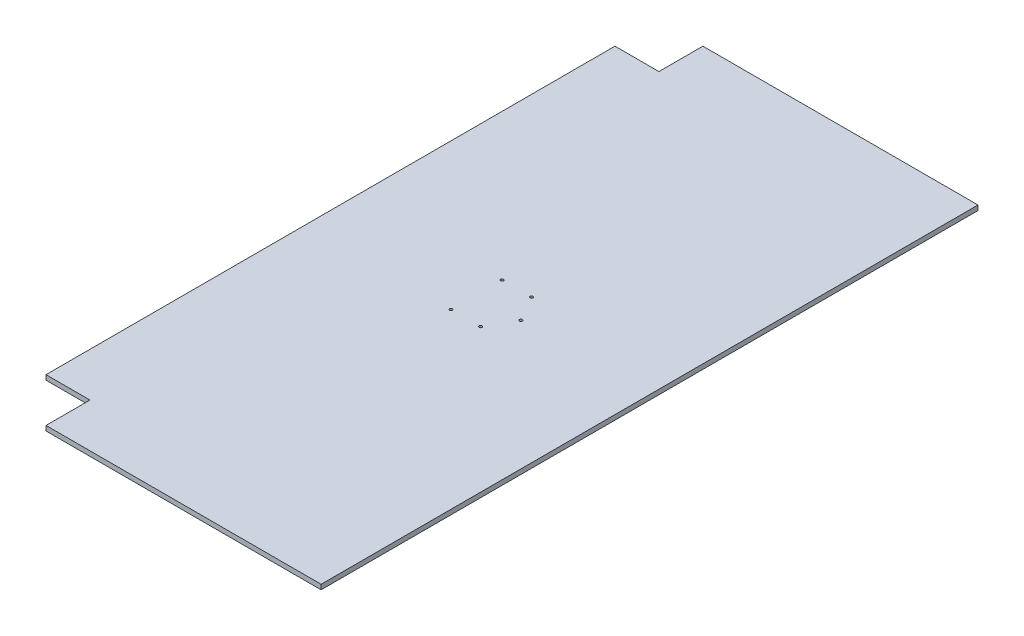
ISO-10303-21;
HEADER;
FILE_DESCRIPTION(('STEP AP214'),'2;1');
FILE_NAME('part.step','',(''),(''),'','','');
FILE_SCHEMA(('AUTOMOTIVE_DESIGN { 1 0 10303 214 1 1 1 1 }'));
ENDSEC;
DATA;
#1=APPLICATION_CONTEXT('core data for automotive mechanical design processes');
#2=APPLICATION_PROTOCOL_DEFINITION('international standard','automotive_design',2000,#1);
#3=PRODUCT_CONTEXT('',#1,'mechanical');
#4=PRODUCT('Part','Part','',(#3));
#5=PRODUCT_RELATED_PRODUCT_CATEGORY('part','',(#4));
#6=PRODUCT_DEFINITION_FORMATION('','',#4);
#7=PRODUCT_DEFINITION_CONTEXT('part definition',#1,'design');
#8=PRODUCT_DEFINITION('design','',#6,#7);
#9=PRODUCT_DEFINITION_SHAPE('','',#8);
#10=(LENGTH_UNIT() NAMED_UNIT(*) SI_UNIT(.MILLI.,.METRE.));
#11=(NAMED_UNIT(*) PLANE_ANGLE_UNIT() SI_UNIT($,.RADIAN.));
#12=(NAMED_UNIT(*) SI_UNIT($,.STERADIAN.) SOLID_ANGLE_UNIT());
#13=UNCERTAINTY_MEASURE_WITH_UNIT(LENGTH_MEASURE(1.E-05),#10,'distance_accuracy_value','');
#14=(GEOMETRIC_REPRESENTATION_CONTEXT(3) GLOBAL_UNCERTAINTY_ASSIGNED_CONTEXT((#13)) GLOBAL_UNIT_ASSIGNED_CONTEXT((#10,
#11,#12)) REPRESENTATION_CONTEXT('',''));
#15=CARTESIAN_POINT('',(0.,0.,0.));
#16=DIRECTION('',(0.,0.,1.));
#17=DIRECTION('',(1.,0.,0.));
#18=AXIS2_PLACEMENT_3D('',#15,#16,#17);
#19=CARTESIAN_POINT('',(0.,9.,612.5));
#20=DIRECTION('',(0.,0.,-1.));
#21=DIRECTION('',(-1.,0.,0.));
#22=AXIS2_PLACEMENT_3D('',#19,#20,#21);
#23=PLANE('',#22);
#24=DIRECTION('',(1.,0.,0.));
#25=VECTOR('',#24,1.);
#26=CARTESIAN_POINT('',(0.,9.,612.5));
#27=LINE('',#26,#25);
#28=CARTESIAN_POINT('',(-222.5,9.,612.5));
#29=VERTEX_POINT('',#28);
#30=CARTESIAN_POINT('',(290.5,9.,612.5));
#31=VERTEX_POINT('',#30);
#32=EDGE_CURVE('E119',#29,#31,#27,.T.);
#33=ORIENTED_EDGE('',*,*,#32,.F.);
#34=DIRECTION('',(0.,1.,0.));
#35=VECTOR('',#34,1.);
#36=CARTESIAN_POINT('',(-222.5,-1.,612.5));
#37=LINE('',#36,#35);
#38=CARTESIAN_POINT('',(-222.5,0.,612.5));
#39=VERTEX_POINT('',#38);
#40=EDGE_CURVE('E105',#39,#29,#37,.T.);
#41=ORIENTED_EDGE('',*,*,#40,.F.);
#42=DIRECTION('',(1.,0.,0.));
#43=VECTOR('',#42,1.);
#44=CARTESIAN_POINT('',(0.,0.,612.5));
#45=LINE('',#44,#43);
#46=CARTESIAN_POINT('',(290.5,0.,612.5));
#47=VERTEX_POINT('',#46);
#48=EDGE_CURVE('E142',#39,#47,#45,.T.);
#49=ORIENTED_EDGE('',*,*,#48,.T.);
#50=DIRECTION('',(0.,1.,0.));
#51=VECTOR('',#50,1.);
#52=CARTESIAN_POINT('',(290.5,-1.,612.5));
#53=LINE('',#52,#51);
#54=EDGE_CURVE('E126',#47,#31,#53,.T.);
#55=ORIENTED_EDGE('',*,*,#54,.T.);
#56=EDGE_LOOP('',(#33,#41,#49,#55));
#57=FACE_BOUND('',#56,.T.);
#58=ADVANCED_FACE('F41',(#57),#23,.F.);
#59=CARTESIAN_POINT('',(0.,9.,-612.5));
#60=DIRECTION('',(0.,0.,-1.));
#61=DIRECTION('',(-1.,0.,0.));
#62=AXIS2_PLACEMENT_3D('',#59,#60,#61);
#63=PLANE('',#62);
#64=DIRECTION('',(0.,1.,0.));
#65=VECTOR('',#64,1.);
#66=CARTESIAN_POINT('',(-222.5,-1.,-612.5));
#67=LINE('',#66,#65);
#68=CARTESIAN_POINT('',(-222.5,0.,-612.5));
#69=VERTEX_POINT('',#68);
#70=CARTESIAN_POINT('',(-222.5,9.,-612.5));
#71=VERTEX_POINT('',#70);
#72=EDGE_CURVE('E168',#69,#71,#67,.T.);
#73=ORIENTED_EDGE('',*,*,#72,.T.);
#74=DIRECTION('',(1.,0.,0.));
#75=VECTOR('',#74,1.);
#76=CARTESIAN_POINT('',(0.,9.,-612.5));
#77=LINE('',#76,#75);
#78=CARTESIAN_POINT('',(290.5,9.,-612.5));
#79=VERTEX_POINT('',#78);
#80=EDGE_CURVE('E127',#71,#79,#77,.T.);
#81=ORIENTED_EDGE('',*,*,#80,.T.);
#82=DIRECTION('',(0.,1.,0.));
#83=VECTOR('',#82,1.);
#84=CARTESIAN_POINT('',(290.5,-1.,-612.5));
#85=LINE('',#84,#83);
#86=CARTESIAN_POINT('',(290.5,0.,-612.5));
#87=VERTEX_POINT('',#86);
#88=EDGE_CURVE('E136',#87,#79,#85,.T.);
#89=ORIENTED_EDGE('',*,*,#88,.F.);
#90=DIRECTION('',(1.,0.,0.));
#91=VECTOR('',#90,1.);
#92=CARTESIAN_POINT('',(0.,0.,-612.5));
#93=LINE('',#92,#91);
#94=EDGE_CURVE('E133',#69,#87,#93,.T.);
#95=ORIENTED_EDGE('',*,*,#94,.F.);
#96=EDGE_LOOP('',(#73,#81,#89,#95));
#97=FACE_BOUND('',#96,.T.);
#98=ADVANCED_FACE('F192',(#97),#63,.T.);
#99=CARTESIAN_POINT('',(-304.5,9.,0.));
#100=DIRECTION('',(-1.,0.,0.));
#101=DIRECTION('',(0.,0.,1.));
#102=AXIS2_PLACEMENT_3D('',#99,#100,#101);
#103=PLANE('',#102);
#104=DIRECTION('',(0.,1.,0.));
#105=VECTOR('',#104,1.);
#106=CARTESIAN_POINT('',(-304.5,-1.,530.5));
#107=LINE('',#106,#105);
#108=CARTESIAN_POINT('',(-304.5,0.,530.5));
#109=VERTEX_POINT('',#108);
#110=CARTESIAN_POINT('',(-304.5,9.,530.5));
#111=VERTEX_POINT('',#110);
#112=EDGE_CURVE('E184',#109,#111,#107,.T.);
#113=ORIENTED_EDGE('',*,*,#112,.T.);
#114=DIRECTION('',(0.,0.,-1.));
#115=VECTOR('',#114,1.);
#116=CARTESIAN_POINT('',(-304.5,9.,0.));
#117=LINE('',#116,#115);
#118=CARTESIAN_POINT('',(-304.5,9.,-530.5));
#119=VERTEX_POINT('',#118);
#120=EDGE_CURVE('E130',#111,#119,#117,.T.);
#121=ORIENTED_EDGE('',*,*,#120,.T.);
#122=DIRECTION('',(0.,1.,0.));
#123=VECTOR('',#122,1.);
#124=CARTESIAN_POINT('',(-304.5,-1.,-530.5));
#125=LINE('',#124,#123);
#126=CARTESIAN_POINT('',(-304.5,0.,-530.5));
#127=VERTEX_POINT('',#126);
#128=EDGE_CURVE('E176',#127,#119,#125,.T.);
#129=ORIENTED_EDGE('',*,*,#128,.F.);
#130=DIRECTION('',(0.,0.,-1.));
#131=VECTOR('',#130,1.);
#132=CARTESIAN_POINT('',(-304.5,0.,0.));
#133=LINE('',#132,#131);
#134=EDGE_CURVE('E128',#109,#127,#133,.T.);
#135=ORIENTED_EDGE('',*,*,#134,.F.);
#136=EDGE_LOOP('',(#113,#121,#129,#135));
#137=FACE_BOUND('',#136,.T.);
#138=ADVANCED_FACE('F194',(#137),#103,.T.);
#139=CARTESIAN_POINT('',(0.,9.,0.));
#140=DIRECTION('',(0.,1.,0.));
#141=DIRECTION('',(0.,0.,1.));
#142=AXIS2_PLACEMENT_3D('',#139,#140,#141);
#143=PLANE('',#142);
#144=CARTESIAN_POINT('',(-32.000000000002,9.,-47.6313972081453));
#145=DIRECTION('',(0.,1.,0.));
#146=DIRECTION('',(0.,0.,1.));
#147=AXIS2_PLACEMENT_3D('',#144,#145,#146);
#148=CIRCLE('',#147,2.75000000000066);
#149=CARTESIAN_POINT('',(-32.000000000002,9.,-44.8813972081447));
#150=VERTEX_POINT('',#149);
#151=EDGE_CURVE('E262',#150,#150,#148,.T.);
#152=ORIENTED_EDGE('',*,*,#151,.F.);
#153=EDGE_LOOP('',(#152));
#154=FACE_BOUND('',#153,.T.);
#155=CARTESIAN_POINT('',(50.5,9.,-4.70023291936268E-12));
#156=DIRECTION('',(0.,1.,0.));
#157=DIRECTION('',(0.,0.,1.));
#158=AXIS2_PLACEMENT_3D('',#155,#156,#157);
#159=CIRCLE('',#158,2.75000000000483);
#160=CARTESIAN_POINT('',(50.5,9.,2.75000000000013));
#161=VERTEX_POINT('',#160);
#162=EDGE_CURVE('E265',#161,#161,#159,.T.);
#163=ORIENTED_EDGE('',*,*,#162,.F.);
#164=EDGE_LOOP('',(#163));
#165=FACE_BOUND('',#164,.T.);
#166=CARTESIAN_POINT('',(23.0000000000021,9.,47.6313972081406));
#167=DIRECTION('',(0.,1.,0.));
#168=DIRECTION('',(0.,0.,1.));
#169=AXIS2_PLACEMENT_3D('',#166,#167,#168);
#170=CIRCLE('',#169,2.75000000000444);
#171=CARTESIAN_POINT('',(23.0000000000021,9.,50.381397208145));
#172=VERTEX_POINT('',#171);
#173=EDGE_CURVE('E268',#172,#172,#170,.T.);
#174=ORIENTED_EDGE('',*,*,#173,.F.);
#175=EDGE_LOOP('',(#174));
#176=FACE_BOUND('',#175,.T.);
#177=CARTESIAN_POINT('',(-31.9999999999979,9.,47.6313972081429));
#178=DIRECTION('',(0.,1.,0.));
#179=DIRECTION('',(0.,0.,1.));
#180=AXIS2_PLACEMENT_3D('',#177,#178,#179);
#181=CIRCLE('',#180,2.75000000000237);
#182=CARTESIAN_POINT('',(-31.9999999999979,9.,50.3813972081453));
#183=VERTEX_POINT('',#182);
#184=EDGE_CURVE('E247',#183,#183,#181,.T.);
#185=ORIENTED_EDGE('',*,*,#184,.F.);
#186=EDGE_LOOP('',(#185));
#187=FACE_BOUND('',#186,.T.);
#188=CARTESIAN_POINT('',(22.999999999998,9.,-47.6313972081477));
#189=DIRECTION('',(0.,1.,0.));
#190=DIRECTION('',(0.,0.,1.));
#191=AXIS2_PLACEMENT_3D('',#188,#189,#190);
#192=CIRCLE('',#191,2.75000000000301);
#193=CARTESIAN_POINT('',(22.999999999998,9.,-44.8813972081446));
#194=VERTEX_POINT('',#193);
#195=EDGE_CURVE('E158',#194,#194,#192,.T.);
#196=ORIENTED_EDGE('',*,*,#195,.F.);
#197=EDGE_LOOP('',(#196));
#198=FACE_BOUND('',#197,.T.);
#199=DIRECTION('',(-1.,0.,0.));
#200=VECTOR('',#199,1.);
#201=CARTESIAN_POINT('',(-304.5,9.,530.5));
#202=LINE('',#201,#200);
#203=CARTESIAN_POINT('',(-222.5,9.,530.5));
#204=VERTEX_POINT('',#203);
#205=EDGE_CURVE('E114',#204,#111,#202,.T.);
#206=ORIENTED_EDGE('',*,*,#205,.F.);
#207=DIRECTION('',(0.,0.,-1.));
#208=VECTOR('',#207,1.);
#209=CARTESIAN_POINT('',(-222.5,9.,612.5));
#210=LINE('',#209,#208);
#211=EDGE_CURVE('E108',#29,#204,#210,.T.);
#212=ORIENTED_EDGE('',*,*,#211,.F.);
#213=ORIENTED_EDGE('',*,*,#32,.T.);
#214=DIRECTION('',(0.,0.,1.));
#215=VECTOR('',#214,1.);
#216=CARTESIAN_POINT('',(290.5,9.,0.));
#217=LINE('',#216,#215);
#218=EDGE_CURVE('E183',#79,#31,#217,.T.);
#219=ORIENTED_EDGE('',*,*,#218,.F.);
#220=ORIENTED_EDGE('',*,*,#80,.F.);
#221=DIRECTION('',(0.,0.,-1.));
#222=VECTOR('',#221,1.);
#223=CARTESIAN_POINT('',(-222.5,9.,-612.5));
#224=LINE('',#223,#222);
#225=CARTESIAN_POINT('',(-222.5,9.,-530.5));
#226=VERTEX_POINT('',#225);
#227=EDGE_CURVE('E180',#226,#71,#224,.T.);
#228=ORIENTED_EDGE('',*,*,#227,.F.);
#229=DIRECTION('',(1.,0.,0.));
#230=VECTOR('',#229,1.);
#231=CARTESIAN_POINT('',(-304.5,9.,-530.5));
#232=LINE('',#231,#230);
#233=EDGE_CURVE('E122',#119,#226,#232,.T.);
#234=ORIENTED_EDGE('',*,*,#233,.F.);
#235=ORIENTED_EDGE('',*,*,#120,.F.);
#236=EDGE_LOOP('',(#206,#212,#213,#219,#220,#228,#234,#235));
#237=FACE_BOUND('',#236,.T.);
#238=ADVANCED_FACE('F117',(#154,#165,#176,#187,#198,#237),#143,.T.);
#239=CARTESIAN_POINT('',(0.,0.,0.));
#240=DIRECTION('',(0.,1.,0.));
#241=DIRECTION('',(0.,0.,1.));
#242=AXIS2_PLACEMENT_3D('',#239,#240,#241);
#243=PLANE('',#242);
#244=CARTESIAN_POINT('',(-32.000000000002,0.,-47.6313972081453));
#245=DIRECTION('',(0.,1.,0.));
#246=DIRECTION('',(0.,0.,1.));
#247=AXIS2_PLACEMENT_3D('',#244,#245,#246);
#248=CIRCLE('',#247,2.75000000000066);
#249=CARTESIAN_POINT('',(-32.000000000002,0.,-44.8813972081447));
#250=VERTEX_POINT('',#249);
#251=EDGE_CURVE('E44',#250,#250,#248,.T.);
#252=ORIENTED_EDGE('',*,*,#251,.T.);
#253=EDGE_LOOP('',(#252));
#254=FACE_BOUND('',#253,.T.);
#255=CARTESIAN_POINT('',(50.5,0.,-4.70023291936268E-12));
#256=DIRECTION('',(0.,1.,0.));
#257=DIRECTION('',(0.,0.,1.));
#258=AXIS2_PLACEMENT_3D('',#255,#256,#257);
#259=CIRCLE('',#258,2.75000000000483);
#260=CARTESIAN_POINT('',(50.5,0.,2.75000000000013));
#261=VERTEX_POINT('',#260);
#262=EDGE_CURVE('E163',#261,#261,#259,.T.);
#263=ORIENTED_EDGE('',*,*,#262,.T.);
#264=EDGE_LOOP('',(#263));
#265=FACE_BOUND('',#264,.T.);
#266=CARTESIAN_POINT('',(23.0000000000021,0.,47.6313972081406));
#267=DIRECTION('',(0.,1.,0.));
#268=DIRECTION('',(0.,0.,1.));
#269=AXIS2_PLACEMENT_3D('',#266,#267,#268);
#270=CIRCLE('',#269,2.75000000000444);
#271=CARTESIAN_POINT('',(23.0000000000021,0.,50.381397208145));
#272=VERTEX_POINT('',#271);
#273=EDGE_CURVE('E161',#272,#272,#270,.T.);
#274=ORIENTED_EDGE('',*,*,#273,.T.);
#275=EDGE_LOOP('',(#274));
#276=FACE_BOUND('',#275,.T.);
#277=CARTESIAN_POINT('',(-31.9999999999979,0.,47.6313972081429));
#278=DIRECTION('',(0.,1.,0.));
#279=DIRECTION('',(0.,0.,1.));
#280=AXIS2_PLACEMENT_3D('',#277,#278,#279);
#281=CIRCLE('',#280,2.75000000000237);
#282=CARTESIAN_POINT('',(-31.9999999999979,0.,50.3813972081453));
#283=VERTEX_POINT('',#282);
#284=EDGE_CURVE('E157',#283,#283,#281,.T.);
#285=ORIENTED_EDGE('',*,*,#284,.T.);
#286=EDGE_LOOP('',(#285));
#287=FACE_BOUND('',#286,.T.);
#288=CARTESIAN_POINT('',(22.999999999998,0.,-47.6313972081477));
#289=DIRECTION('',(0.,1.,0.));
#290=DIRECTION('',(0.,0.,1.));
#291=AXIS2_PLACEMENT_3D('',#288,#289,#290);
#292=CIRCLE('',#291,2.75000000000301);
#293=CARTESIAN_POINT('',(22.999999999998,0.,-44.8813972081446));
#294=VERTEX_POINT('',#293);
#295=EDGE_CURVE('E154',#294,#294,#292,.T.);
#296=ORIENTED_EDGE('',*,*,#295,.T.);
#297=EDGE_LOOP('',(#296));
#298=FACE_BOUND('',#297,.T.);
#299=DIRECTION('',(0.,0.,-1.));
#300=VECTOR('',#299,1.);
#301=CARTESIAN_POINT('',(-222.5,0.,0.));
#302=LINE('',#301,#300);
#303=CARTESIAN_POINT('',(-222.5,0.,530.5));
#304=VERTEX_POINT('',#303);
#305=EDGE_CURVE('E49',#39,#304,#302,.T.);
#306=ORIENTED_EDGE('',*,*,#305,.T.);
#307=DIRECTION('',(-1.,0.,0.));
#308=VECTOR('',#307,1.);
#309=CARTESIAN_POINT('',(0.,0.,530.5));
#310=LINE('',#309,#308);
#311=EDGE_CURVE('E11',#304,#109,#310,.T.);
#312=ORIENTED_EDGE('',*,*,#311,.T.);
#313=ORIENTED_EDGE('',*,*,#134,.T.);
#314=DIRECTION('',(1.,0.,0.));
#315=VECTOR('',#314,1.);
#316=CARTESIAN_POINT('',(0.,0.,-530.5));
#317=LINE('',#316,#315);
#318=CARTESIAN_POINT('',(-222.5,0.,-530.5));
#319=VERTEX_POINT('',#318);
#320=EDGE_CURVE('E147',#127,#319,#317,.T.);
#321=ORIENTED_EDGE('',*,*,#320,.T.);
#322=DIRECTION('',(0.,0.,-1.));
#323=VECTOR('',#322,1.);
#324=CARTESIAN_POINT('',(-222.5,0.,0.));
#325=LINE('',#324,#323);
#326=EDGE_CURVE('E150',#319,#69,#325,.T.);
#327=ORIENTED_EDGE('',*,*,#326,.T.);
#328=ORIENTED_EDGE('',*,*,#94,.T.);
#329=DIRECTION('',(0.,0.,1.));
#330=VECTOR('',#329,1.);
#331=CARTESIAN_POINT('',(290.5,0.,0.));
#332=LINE('',#331,#330);
#333=EDGE_CURVE('E141',#87,#47,#332,.T.);
#334=ORIENTED_EDGE('',*,*,#333,.T.);
#335=ORIENTED_EDGE('',*,*,#48,.F.);
#336=EDGE_LOOP('',(#306,#312,#313,#321,#327,#328,#334,#335));
#337=FACE_BOUND('',#336,.T.);
#338=ADVANCED_FACE('F202',(#254,#265,#276,#287,#298,#337),#243,.F.);
#339=CARTESIAN_POINT('',(290.5,-1.,0.));
#340=DIRECTION('',(-1.,0.,0.));
#341=DIRECTION('',(0.,0.,1.));
#342=AXIS2_PLACEMENT_3D('',#339,#340,#341);
#343=PLANE('',#342);
#344=ORIENTED_EDGE('',*,*,#88,.T.);
#345=ORIENTED_EDGE('',*,*,#218,.T.);
#346=ORIENTED_EDGE('',*,*,#54,.F.);
#347=ORIENTED_EDGE('',*,*,#333,.F.);
#348=EDGE_LOOP('',(#344,#345,#346,#347));
#349=FACE_BOUND('',#348,.T.);
#350=ADVANCED_FACE('F189',(#349),#343,.F.);
#351=CARTESIAN_POINT('',(-222.5,-1.,-612.5));
#352=DIRECTION('',(1.,0.,0.));
#353=DIRECTION('',(0.,0.,-1.));
#354=AXIS2_PLACEMENT_3D('',#351,#352,#353);
#355=PLANE('',#354);
#356=DIRECTION('',(0.,1.,0.));
#357=VECTOR('',#356,1.);
#358=CARTESIAN_POINT('',(-222.5,-1.,-530.5));
#359=LINE('',#358,#357);
#360=EDGE_CURVE('E65',#319,#226,#359,.T.);
#361=ORIENTED_EDGE('',*,*,#360,.T.);
#362=ORIENTED_EDGE('',*,*,#227,.T.);
#363=ORIENTED_EDGE('',*,*,#72,.F.);
#364=ORIENTED_EDGE('',*,*,#326,.F.);
#365=EDGE_LOOP('',(#361,#362,#363,#364));
#366=FACE_BOUND('',#365,.T.);
#367=ADVANCED_FACE('F210',(#366),#355,.F.);
#368=CARTESIAN_POINT('',(-304.5,-1.,-530.5));
#369=DIRECTION('',(0.,0.,1.));
#370=DIRECTION('',(1.,0.,0.));
#371=AXIS2_PLACEMENT_3D('',#368,#369,#370);
#372=PLANE('',#371);
#373=ORIENTED_EDGE('',*,*,#128,.T.);
#374=ORIENTED_EDGE('',*,*,#233,.T.);
#375=ORIENTED_EDGE('',*,*,#360,.F.);
#376=ORIENTED_EDGE('',*,*,#320,.F.);
#377=EDGE_LOOP('',(#373,#374,#375,#376));
#378=FACE_BOUND('',#377,.T.);
#379=ADVANCED_FACE('F213',(#378),#372,.F.);
#380=CARTESIAN_POINT('',(-304.5,-1.,530.5));
#381=DIRECTION('',(0.,0.,-1.));
#382=DIRECTION('',(-1.,0.,0.));
#383=AXIS2_PLACEMENT_3D('',#380,#381,#382);
#384=PLANE('',#383);
#385=DIRECTION('',(0.,1.,0.));
#386=VECTOR('',#385,1.);
#387=CARTESIAN_POINT('',(-222.5,-1.,530.5));
#388=LINE('',#387,#386);
#389=EDGE_CURVE('E57',#304,#204,#388,.T.);
#390=ORIENTED_EDGE('',*,*,#389,.T.);
#391=ORIENTED_EDGE('',*,*,#205,.T.);
#392=ORIENTED_EDGE('',*,*,#112,.F.);
#393=ORIENTED_EDGE('',*,*,#311,.F.);
#394=EDGE_LOOP('',(#390,#391,#392,#393));
#395=FACE_BOUND('',#394,.T.);
#396=ADVANCED_FACE('F217',(#395),#384,.F.);
#397=CARTESIAN_POINT('',(-222.5,-1.,612.5));
#398=DIRECTION('',(1.,0.,0.));
#399=DIRECTION('',(0.,0.,-1.));
#400=AXIS2_PLACEMENT_3D('',#397,#398,#399);
#401=PLANE('',#400);
#402=ORIENTED_EDGE('',*,*,#40,.T.);
#403=ORIENTED_EDGE('',*,*,#211,.T.);
#404=ORIENTED_EDGE('',*,*,#389,.F.);
#405=ORIENTED_EDGE('',*,*,#305,.F.);
#406=EDGE_LOOP('',(#402,#403,#404,#405));
#407=FACE_BOUND('',#406,.T.);
#408=ADVANCED_FACE('F107',(#407),#401,.F.);
#409=CARTESIAN_POINT('',(22.999999999998,-1.,-47.6313972081477));
#410=DIRECTION('',(0.,1.,0.));
#411=DIRECTION('',(0.,0.,1.));
#412=AXIS2_PLACEMENT_3D('',#409,#410,#411);
#413=CYLINDRICAL_SURFACE('',#412,2.75000000000301);
#414=ORIENTED_EDGE('',*,*,#195,.T.);
#415=EDGE_LOOP('',(#414));
#416=FACE_BOUND('',#415,.T.);
#417=ORIENTED_EDGE('',*,*,#295,.F.);
#418=EDGE_LOOP('',(#417));
#419=FACE_BOUND('',#418,.T.);
#420=ADVANCED_FACE('F220',(#416,#419),#413,.F.);
#421=CARTESIAN_POINT('',(-31.9999999999979,-1.,47.6313972081429));
#422=DIRECTION('',(0.,1.,0.));
#423=DIRECTION('',(0.,0.,1.));
#424=AXIS2_PLACEMENT_3D('',#421,#422,#423);
#425=CYLINDRICAL_SURFACE('',#424,2.75000000000237);
#426=ORIENTED_EDGE('',*,*,#184,.T.);
#427=EDGE_LOOP('',(#426));
#428=FACE_BOUND('',#427,.T.);
#429=ORIENTED_EDGE('',*,*,#284,.F.);
#430=EDGE_LOOP('',(#429));
#431=FACE_BOUND('',#430,.T.);
#432=ADVANCED_FACE('F226',(#428,#431),#425,.F.);
#433=CARTESIAN_POINT('',(23.0000000000021,-1.,47.6313972081406));
#434=DIRECTION('',(0.,1.,0.));
#435=DIRECTION('',(0.,0.,1.));
#436=AXIS2_PLACEMENT_3D('',#433,#434,#435);
#437=CYLINDRICAL_SURFACE('',#436,2.75000000000444);
#438=ORIENTED_EDGE('',*,*,#173,.T.);
#439=EDGE_LOOP('',(#438));
#440=FACE_BOUND('',#439,.T.);
#441=ORIENTED_EDGE('',*,*,#273,.F.);
#442=EDGE_LOOP('',(#441));
#443=FACE_BOUND('',#442,.T.);
#444=ADVANCED_FACE('F235',(#440,#443),#437,.F.);
#445=CARTESIAN_POINT('',(50.5,-1.,-4.70023291936268E-12));
#446=DIRECTION('',(0.,1.,0.));
#447=DIRECTION('',(0.,0.,1.));
#448=AXIS2_PLACEMENT_3D('',#445,#446,#447);
#449=CYLINDRICAL_SURFACE('',#448,2.75000000000483);
#450=ORIENTED_EDGE('',*,*,#162,.T.);
#451=EDGE_LOOP('',(#450));
#452=FACE_BOUND('',#451,.T.);
#453=ORIENTED_EDGE('',*,*,#262,.F.);
#454=EDGE_LOOP('',(#453));
#455=FACE_BOUND('',#454,.T.);
#456=ADVANCED_FACE('F231',(#452,#455),#449,.F.);
#457=CARTESIAN_POINT('',(-32.000000000002,-1.,-47.6313972081453));
#458=DIRECTION('',(0.,1.,0.));
#459=DIRECTION('',(0.,0.,1.));
#460=AXIS2_PLACEMENT_3D('',#457,#458,#459);
#461=CYLINDRICAL_SURFACE('',#460,2.75000000000066);
#462=ORIENTED_EDGE('',*,*,#151,.T.);
#463=EDGE_LOOP('',(#462));
#464=FACE_BOUND('',#463,.T.);
#465=ORIENTED_EDGE('',*,*,#251,.F.);
#466=EDGE_LOOP('',(#465));
#467=FACE_BOUND('',#466,.T.);
#468=ADVANCED_FACE('F228',(#464,#467),#461,.F.);
#469=CLOSED_SHELL('',(#58,#98,#138,#238,#338,#350,#367,#379,#396,#408,#420,#432,#444,#456,#468));
#470=MANIFOLD_SOLID_BREP('B2',#469);
#471=ADVANCED_BREP_SHAPE_REPRESENTATION('',(#18,#470),#14);
#472=SHAPE_DEFINITION_REPRESENTATION(#9,#471);
ENDSEC;
END-ISO-10303-21;
